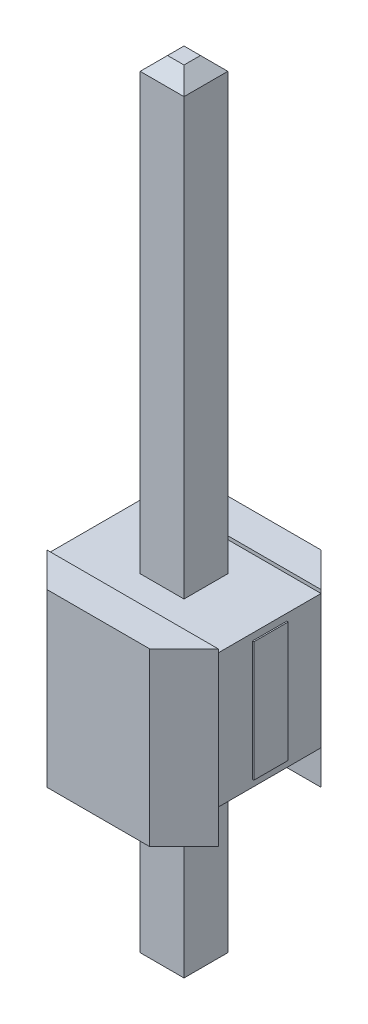
ISO-10303-21;
HEADER;
FILE_DESCRIPTION(('STEP AP214'),'2;1');
FILE_NAME('part.step','',(''),(''),'','','');
FILE_SCHEMA(('AUTOMOTIVE_DESIGN { 1 0 10303 214 1 1 1 1 }'));
ENDSEC;
DATA;
#1=APPLICATION_CONTEXT('core data for automotive mechanical design processes');
#2=APPLICATION_PROTOCOL_DEFINITION('international standard','automotive_design',2000,#1);
#3=PRODUCT_CONTEXT('',#1,'mechanical');
#4=PRODUCT('Part','Part','',(#3));
#5=PRODUCT_RELATED_PRODUCT_CATEGORY('part','',(#4));
#6=PRODUCT_DEFINITION_FORMATION('','',#4);
#7=PRODUCT_DEFINITION_CONTEXT('part definition',#1,'design');
#8=PRODUCT_DEFINITION('design','',#6,#7);
#9=PRODUCT_DEFINITION_SHAPE('','',#8);
#10=(LENGTH_UNIT() NAMED_UNIT(*) SI_UNIT(.MILLI.,.METRE.));
#11=(NAMED_UNIT(*) PLANE_ANGLE_UNIT() SI_UNIT($,.RADIAN.));
#12=(NAMED_UNIT(*) SI_UNIT($,.STERADIAN.) SOLID_ANGLE_UNIT());
#13=UNCERTAINTY_MEASURE_WITH_UNIT(LENGTH_MEASURE(1.E-05),#10,'distance_accuracy_value','');
#14=(GEOMETRIC_REPRESENTATION_CONTEXT(3) GLOBAL_UNCERTAINTY_ASSIGNED_CONTEXT((#13)) GLOBAL_UNIT_ASSIGNED_CONTEXT((#10,
#11,#12)) REPRESENTATION_CONTEXT('',''));
#15=CARTESIAN_POINT('',(0.,0.,0.));
#16=DIRECTION('',(0.,0.,1.));
#17=DIRECTION('',(1.,0.,0.));
#18=AXIS2_PLACEMENT_3D('',#15,#16,#17);
#19=CARTESIAN_POINT('',(1.25,0.,0.));
#20=DIRECTION('',(1.,0.,0.));
#21=DIRECTION('',(0.,0.,-1.));
#22=AXIS2_PLACEMENT_3D('',#19,#20,#21);
#23=PLANE('',#22);
#24=DIRECTION('',(0.,0.,1.));
#25=VECTOR('',#24,1.);
#26=CARTESIAN_POINT('',(1.25,1.2,-0.75));
#27=LINE('',#26,#25);
#28=CARTESIAN_POINT('',(1.25,1.2,-0.75));
#29=VERTEX_POINT('',#28);
#30=CARTESIAN_POINT('',(1.25,1.2,0.750000000000001));
#31=VERTEX_POINT('',#30);
#32=EDGE_CURVE('E302',#29,#31,#27,.T.);
#33=ORIENTED_EDGE('',*,*,#32,.T.);
#34=DIRECTION('',(0.,-1.,0.));
#35=VECTOR('',#34,1.);
#36=CARTESIAN_POINT('',(1.25,-1.25,0.75));
#37=LINE('',#36,#35);
#38=CARTESIAN_POINT('',(1.25,-0.75,0.750000000000001));
#39=VERTEX_POINT('',#38);
#40=EDGE_CURVE('E393',#31,#39,#37,.T.);
#41=ORIENTED_EDGE('',*,*,#40,.T.);
#42=DIRECTION('',(0.,0.,1.));
#43=VECTOR('',#42,1.);
#44=CARTESIAN_POINT('',(1.25,-0.75,-0.75));
#45=LINE('',#44,#43);
#46=CARTESIAN_POINT('',(1.25,-0.75,-0.75));
#47=VERTEX_POINT('',#46);
#48=EDGE_CURVE('E292',#47,#39,#45,.T.);
#49=ORIENTED_EDGE('',*,*,#48,.F.);
#50=DIRECTION('',(0.,1.,0.));
#51=VECTOR('',#50,1.);
#52=CARTESIAN_POINT('',(1.25,0.,-0.749999999999998));
#53=LINE('',#52,#51);
#54=EDGE_CURVE('E391',#47,#29,#53,.T.);
#55=ORIENTED_EDGE('',*,*,#54,.T.);
#56=EDGE_LOOP('',(#33,#41,#49,#55));
#57=FACE_BOUND('',#56,.T.);
#58=DIRECTION('',(0.,0.,1.));
#59=VECTOR('',#58,1.);
#60=CARTESIAN_POINT('',(1.25,-0.65,0.));
#61=LINE('',#60,#59);
#62=CARTESIAN_POINT('',(1.25,-0.65,-0.25));
#63=VERTEX_POINT('',#62);
#64=CARTESIAN_POINT('',(1.25,-0.65,0.25));
#65=VERTEX_POINT('',#64);
#66=EDGE_CURVE('E285',#63,#65,#61,.T.);
#67=ORIENTED_EDGE('',*,*,#66,.T.);
#68=DIRECTION('',(0.,1.,0.));
#69=VECTOR('',#68,1.);
#70=CARTESIAN_POINT('',(1.25,0.,0.25));
#71=LINE('',#70,#69);
#72=CARTESIAN_POINT('',(1.25,1.1,0.25));
#73=VERTEX_POINT('',#72);
#74=EDGE_CURVE('E273',#65,#73,#71,.T.);
#75=ORIENTED_EDGE('',*,*,#74,.T.);
#76=DIRECTION('',(0.,0.,-1.));
#77=VECTOR('',#76,1.);
#78=CARTESIAN_POINT('',(1.25,1.1,0.));
#79=LINE('',#78,#77);
#80=CARTESIAN_POINT('',(1.25,1.1,-0.25));
#81=VERTEX_POINT('',#80);
#82=EDGE_CURVE('E274',#73,#81,#79,.T.);
#83=ORIENTED_EDGE('',*,*,#82,.T.);
#84=DIRECTION('',(0.,-1.,0.));
#85=VECTOR('',#84,1.);
#86=CARTESIAN_POINT('',(1.25,0.,-0.25));
#87=LINE('',#86,#85);
#88=EDGE_CURVE('E278',#81,#63,#87,.T.);
#89=ORIENTED_EDGE('',*,*,#88,.T.);
#90=EDGE_LOOP('',(#67,#75,#83,#89));
#91=FACE_BOUND('',#90,.T.);
#92=ADVANCED_FACE('F39',(#57,#91),#23,.T.);
#93=CARTESIAN_POINT('',(-1.25,0.,0.));
#94=DIRECTION('',(1.,0.,0.));
#95=DIRECTION('',(0.,0.,-1.));
#96=AXIS2_PLACEMENT_3D('',#93,#94,#95);
#97=PLANE('',#96);
#98=DIRECTION('',(0.,0.,1.));
#99=VECTOR('',#98,1.);
#100=CARTESIAN_POINT('',(-1.25,-0.75,-0.75));
#101=LINE('',#100,#99);
#102=CARTESIAN_POINT('',(-1.25,-0.75,-0.75));
#103=VERTEX_POINT('',#102);
#104=CARTESIAN_POINT('',(-1.25,-0.75,0.750000000000001));
#105=VERTEX_POINT('',#104);
#106=EDGE_CURVE('E311',#103,#105,#101,.T.);
#107=ORIENTED_EDGE('',*,*,#106,.T.);
#108=DIRECTION('',(0.,1.,0.));
#109=VECTOR('',#108,1.);
#110=CARTESIAN_POINT('',(-1.25,0.,0.749999999999998));
#111=LINE('',#110,#109);
#112=CARTESIAN_POINT('',(-1.25,1.2,0.750000000000001));
#113=VERTEX_POINT('',#112);
#114=EDGE_CURVE('E423',#105,#113,#111,.T.);
#115=ORIENTED_EDGE('',*,*,#114,.T.);
#116=DIRECTION('',(0.,0.,1.));
#117=VECTOR('',#116,1.);
#118=CARTESIAN_POINT('',(-1.25,1.2,-0.75));
#119=LINE('',#118,#117);
#120=CARTESIAN_POINT('',(-1.25,1.2,-0.75));
#121=VERTEX_POINT('',#120);
#122=EDGE_CURVE('E320',#121,#113,#119,.T.);
#123=ORIENTED_EDGE('',*,*,#122,.F.);
#124=DIRECTION('',(0.,-1.,0.));
#125=VECTOR('',#124,1.);
#126=CARTESIAN_POINT('',(-1.25,-1.25,-0.749999999999999));
#127=LINE('',#126,#125);
#128=EDGE_CURVE('E421',#121,#103,#127,.T.);
#129=ORIENTED_EDGE('',*,*,#128,.T.);
#130=EDGE_LOOP('',(#107,#115,#123,#129));
#131=FACE_BOUND('',#130,.T.);
#132=DIRECTION('',(0.,1.,0.));
#133=VECTOR('',#132,1.);
#134=CARTESIAN_POINT('',(-1.25,0.,0.25));
#135=LINE('',#134,#133);
#136=CARTESIAN_POINT('',(-1.25,-0.65,0.25));
#137=VERTEX_POINT('',#136);
#138=CARTESIAN_POINT('',(-1.25,1.1,0.25));
#139=VERTEX_POINT('',#138);
#140=EDGE_CURVE('E434',#137,#139,#135,.T.);
#141=ORIENTED_EDGE('',*,*,#140,.F.);
#142=DIRECTION('',(0.,0.,1.));
#143=VECTOR('',#142,1.);
#144=CARTESIAN_POINT('',(-1.25,-0.65,0.));
#145=LINE('',#144,#143);
#146=CARTESIAN_POINT('',(-1.25,-0.65,-0.25));
#147=VERTEX_POINT('',#146);
#148=EDGE_CURVE('E431',#147,#137,#145,.T.);
#149=ORIENTED_EDGE('',*,*,#148,.F.);
#150=DIRECTION('',(0.,-1.,0.));
#151=VECTOR('',#150,1.);
#152=CARTESIAN_POINT('',(-1.25,0.,-0.25));
#153=LINE('',#152,#151);
#154=CARTESIAN_POINT('',(-1.25,1.1,-0.25));
#155=VERTEX_POINT('',#154);
#156=EDGE_CURVE('E428',#155,#147,#153,.T.);
#157=ORIENTED_EDGE('',*,*,#156,.F.);
#158=DIRECTION('',(0.,0.,-1.));
#159=VECTOR('',#158,1.);
#160=CARTESIAN_POINT('',(-1.25,1.1,0.));
#161=LINE('',#160,#159);
#162=EDGE_CURVE('E425',#139,#155,#161,.T.);
#163=ORIENTED_EDGE('',*,*,#162,.F.);
#164=EDGE_LOOP('',(#141,#149,#157,#163));
#165=FACE_BOUND('',#164,.T.);
#166=ADVANCED_FACE('F530',(#131,#165),#97,.F.);
#167=CARTESIAN_POINT('',(0.32,7.75,0.320000000000001));
#168=DIRECTION('',(0.,0.,-1.));
#169=DIRECTION('',(0.,1.,0.));
#170=AXIS2_PLACEMENT_3D('',#167,#168,#169);
#171=PLANE('',#170);
#172=DIRECTION('',(0.,-1.,0.));
#173=VECTOR('',#172,1.);
#174=CARTESIAN_POINT('',(0.32,7.75,0.320000000000001));
#175=LINE('',#174,#173);
#176=CARTESIAN_POINT('',(0.32,7.55,0.320000000000001));
#177=VERTEX_POINT('',#176);
#178=CARTESIAN_POINT('',(0.32,1.2,0.32));
#179=VERTEX_POINT('',#178);
#180=EDGE_CURVE('E374',#177,#179,#175,.T.);
#181=ORIENTED_EDGE('',*,*,#180,.F.);
#182=DIRECTION('',(-1.,0.,0.));
#183=VECTOR('',#182,1.);
#184=CARTESIAN_POINT('',(0.32,7.55,0.320000000000001));
#185=LINE('',#184,#183);
#186=CARTESIAN_POINT('',(-0.32,7.55,0.320000000000001));
#187=VERTEX_POINT('',#186);
#188=EDGE_CURVE('E451',#177,#187,#185,.T.);
#189=ORIENTED_EDGE('',*,*,#188,.T.);
#190=DIRECTION('',(0.,-1.,0.));
#191=VECTOR('',#190,1.);
#192=CARTESIAN_POINT('',(-0.32,7.75,0.320000000000001));
#193=LINE('',#192,#191);
#194=CARTESIAN_POINT('',(-0.32,1.2,0.32));
#195=VERTEX_POINT('',#194);
#196=EDGE_CURVE('E381',#187,#195,#193,.T.);
#197=ORIENTED_EDGE('',*,*,#196,.T.);
#198=DIRECTION('',(-1.,0.,0.));
#199=VECTOR('',#198,1.);
#200=CARTESIAN_POINT('',(0.32,1.2,0.32));
#201=LINE('',#200,#199);
#202=EDGE_CURVE('E367',#179,#195,#201,.T.);
#203=ORIENTED_EDGE('',*,*,#202,.F.);
#204=EDGE_LOOP('',(#181,#189,#197,#203));
#205=FACE_BOUND('',#204,.T.);
#206=ADVANCED_FACE('F537',(#205),#171,.F.);
#207=CARTESIAN_POINT('',(0.32,7.75,-0.32));
#208=DIRECTION('',(0.,0.,1.));
#209=DIRECTION('',(0.,-1.,0.));
#210=AXIS2_PLACEMENT_3D('',#207,#208,#209);
#211=PLANE('',#210);
#212=DIRECTION('',(0.,1.,0.));
#213=VECTOR('',#212,1.);
#214=CARTESIAN_POINT('',(-0.32,7.75,-0.32));
#215=LINE('',#214,#213);
#216=CARTESIAN_POINT('',(-0.32,1.2,-0.320000000000001));
#217=VERTEX_POINT('',#216);
#218=CARTESIAN_POINT('',(-0.32,7.55,-0.32));
#219=VERTEX_POINT('',#218);
#220=EDGE_CURVE('E383',#217,#219,#215,.T.);
#221=ORIENTED_EDGE('',*,*,#220,.T.);
#222=DIRECTION('',(1.,0.,0.));
#223=VECTOR('',#222,1.);
#224=CARTESIAN_POINT('',(0.32,7.55,-0.32));
#225=LINE('',#224,#223);
#226=CARTESIAN_POINT('',(0.32,7.55,-0.32));
#227=VERTEX_POINT('',#226);
#228=EDGE_CURVE('E446',#219,#227,#225,.T.);
#229=ORIENTED_EDGE('',*,*,#228,.T.);
#230=DIRECTION('',(0.,1.,0.));
#231=VECTOR('',#230,1.);
#232=CARTESIAN_POINT('',(0.32,7.75,-0.32));
#233=LINE('',#232,#231);
#234=CARTESIAN_POINT('',(0.32,1.2,-0.32));
#235=VERTEX_POINT('',#234);
#236=EDGE_CURVE('E376',#235,#227,#233,.T.);
#237=ORIENTED_EDGE('',*,*,#236,.F.);
#238=DIRECTION('',(1.,0.,0.));
#239=VECTOR('',#238,1.);
#240=CARTESIAN_POINT('',(0.32,1.2,-0.32));
#241=LINE('',#240,#239);
#242=EDGE_CURVE('E365',#217,#235,#241,.T.);
#243=ORIENTED_EDGE('',*,*,#242,.F.);
#244=EDGE_LOOP('',(#221,#229,#237,#243));
#245=FACE_BOUND('',#244,.T.);
#246=ADVANCED_FACE('F592',(#245),#211,.F.);
#247=CARTESIAN_POINT('',(0.32,0.,0.));
#248=DIRECTION('',(-1.,0.,0.));
#249=DIRECTION('',(0.,0.,1.));
#250=AXIS2_PLACEMENT_3D('',#247,#248,#249);
#251=PLANE('',#250);
#252=ORIENTED_EDGE('',*,*,#236,.T.);
#253=DIRECTION('',(0.,0.,1.));
#254=VECTOR('',#253,1.);
#255=CARTESIAN_POINT('',(0.32,7.55,0.));
#256=LINE('',#255,#254);
#257=EDGE_CURVE('E449',#227,#177,#256,.T.);
#258=ORIENTED_EDGE('',*,*,#257,.T.);
#259=ORIENTED_EDGE('',*,*,#180,.T.);
#260=DIRECTION('',(0.,0.,1.));
#261=VECTOR('',#260,1.);
#262=CARTESIAN_POINT('',(0.32,1.2,0.));
#263=LINE('',#262,#261);
#264=EDGE_CURVE('E370',#235,#179,#263,.T.);
#265=ORIENTED_EDGE('',*,*,#264,.F.);
#266=EDGE_LOOP('',(#252,#258,#259,#265));
#267=FACE_BOUND('',#266,.T.);
#268=ADVANCED_FACE('F522',(#267),#251,.F.);
#269=CARTESIAN_POINT('',(-0.32,0.,0.));
#270=DIRECTION('',(-1.,0.,0.));
#271=DIRECTION('',(0.,0.,1.));
#272=AXIS2_PLACEMENT_3D('',#269,#270,#271);
#273=PLANE('',#272);
#274=ORIENTED_EDGE('',*,*,#196,.F.);
#275=DIRECTION('',(0.,0.,-1.));
#276=VECTOR('',#275,1.);
#277=CARTESIAN_POINT('',(-0.32,7.55,-0.32));
#278=LINE('',#277,#276);
#279=EDGE_CURVE('E453',#187,#219,#278,.T.);
#280=ORIENTED_EDGE('',*,*,#279,.T.);
#281=ORIENTED_EDGE('',*,*,#220,.F.);
#282=DIRECTION('',(0.,0.,1.));
#283=VECTOR('',#282,1.);
#284=CARTESIAN_POINT('',(-0.32,1.2,0.));
#285=LINE('',#284,#283);
#286=EDGE_CURVE('E388',#217,#195,#285,.T.);
#287=ORIENTED_EDGE('',*,*,#286,.T.);
#288=EDGE_LOOP('',(#274,#280,#281,#287));
#289=FACE_BOUND('',#288,.T.);
#290=ADVANCED_FACE('F590',(#289),#273,.T.);
#291=CARTESIAN_POINT('',(0.32,7.75,0.320000000000001));
#292=DIRECTION('',(0.,-1.,0.));
#293=DIRECTION('',(0.,0.,-1.));
#294=AXIS2_PLACEMENT_3D('',#291,#292,#293);
#295=PLANE('',#294);
#296=DIRECTION('',(0.,0.,-1.));
#297=VECTOR('',#296,1.);
#298=CARTESIAN_POINT('',(0.119999999999999,7.75,0.320000000000001));
#299=LINE('',#298,#297);
#300=CARTESIAN_POINT('',(0.119999999999999,7.75,0.12));
#301=VERTEX_POINT('',#300);
#302=CARTESIAN_POINT('',(0.119999999999999,7.75,-0.119999999999999));
#303=VERTEX_POINT('',#302);
#304=EDGE_CURVE('E441',#301,#303,#299,.T.);
#305=ORIENTED_EDGE('',*,*,#304,.T.);
#306=DIRECTION('',(-1.,0.,0.));
#307=VECTOR('',#306,1.);
#308=CARTESIAN_POINT('',(0.32,7.75,-0.119999999999999));
#309=LINE('',#308,#307);
#310=CARTESIAN_POINT('',(-0.119999999999999,7.75,-0.119999999999999));
#311=VERTEX_POINT('',#310);
#312=EDGE_CURVE('E443',#303,#311,#309,.T.);
#313=ORIENTED_EDGE('',*,*,#312,.T.);
#314=DIRECTION('',(0.,0.,1.));
#315=VECTOR('',#314,1.);
#316=CARTESIAN_POINT('',(-0.119999999999999,7.75,0.320000000000001));
#317=LINE('',#316,#315);
#318=CARTESIAN_POINT('',(-0.119999999999999,7.75,0.12));
#319=VERTEX_POINT('',#318);
#320=EDGE_CURVE('E437',#311,#319,#317,.T.);
#321=ORIENTED_EDGE('',*,*,#320,.T.);
#322=DIRECTION('',(1.,0.,0.));
#323=VECTOR('',#322,1.);
#324=CARTESIAN_POINT('',(0.32,7.75,0.12));
#325=LINE('',#324,#323);
#326=EDGE_CURVE('E439',#319,#301,#325,.T.);
#327=ORIENTED_EDGE('',*,*,#326,.T.);
#328=EDGE_LOOP('',(#305,#313,#321,#327));
#329=FACE_BOUND('',#328,.T.);
#330=ADVANCED_FACE('F566',(#329),#295,.F.);
#331=CARTESIAN_POINT('',(1.25,1.2,-0.75));
#332=DIRECTION('',(0.,-1.,0.));
#333=DIRECTION('',(0.,0.,-1.));
#334=AXIS2_PLACEMENT_3D('',#331,#332,#333);
#335=PLANE('',#334);
#336=ORIENTED_EDGE('',*,*,#122,.T.);
#337=DIRECTION('',(-1.,0.,0.));
#338=VECTOR('',#337,1.);
#339=CARTESIAN_POINT('',(1.25,1.2,0.750000000000001));
#340=LINE('',#339,#338);
#341=EDGE_CURVE('E340',#31,#113,#340,.T.);
#342=ORIENTED_EDGE('',*,*,#341,.F.);
#343=ORIENTED_EDGE('',*,*,#32,.F.);
#344=DIRECTION('',(-1.,0.,0.));
#345=VECTOR('',#344,1.);
#346=CARTESIAN_POINT('',(1.25,1.2,-0.75));
#347=LINE('',#346,#345);
#348=EDGE_CURVE('E337',#29,#121,#347,.T.);
#349=ORIENTED_EDGE('',*,*,#348,.T.);
#350=EDGE_LOOP('',(#336,#342,#343,#349));
#351=FACE_BOUND('',#350,.T.);
#352=ORIENTED_EDGE('',*,*,#242,.T.);
#353=ORIENTED_EDGE('',*,*,#264,.T.);
#354=ORIENTED_EDGE('',*,*,#202,.T.);
#355=ORIENTED_EDGE('',*,*,#286,.F.);
#356=EDGE_LOOP('',(#352,#353,#354,#355));
#357=FACE_BOUND('',#356,.T.);
#358=ADVANCED_FACE('F562',(#351,#357),#335,.F.);
#359=CARTESIAN_POINT('',(1.25,-0.75,-0.75));
#360=DIRECTION('',(0.,-1.,0.));
#361=DIRECTION('',(0.,0.,-1.));
#362=AXIS2_PLACEMENT_3D('',#359,#360,#361);
#363=PLANE('',#362);
#364=ORIENTED_EDGE('',*,*,#106,.F.);
#365=DIRECTION('',(-1.,0.,0.));
#366=VECTOR('',#365,1.);
#367=CARTESIAN_POINT('',(1.25,-0.75,-0.75));
#368=LINE('',#367,#366);
#369=EDGE_CURVE('E308',#47,#103,#368,.T.);
#370=ORIENTED_EDGE('',*,*,#369,.F.);
#371=ORIENTED_EDGE('',*,*,#48,.T.);
#372=DIRECTION('',(-1.,0.,0.));
#373=VECTOR('',#372,1.);
#374=CARTESIAN_POINT('',(1.25,-0.75,0.750000000000001));
#375=LINE('',#374,#373);
#376=EDGE_CURVE('E354',#39,#105,#375,.T.);
#377=ORIENTED_EDGE('',*,*,#376,.T.);
#378=EDGE_LOOP('',(#364,#370,#371,#377));
#379=FACE_BOUND('',#378,.T.);
#380=DIRECTION('',(0.,0.,1.));
#381=VECTOR('',#380,1.);
#382=CARTESIAN_POINT('',(0.32,-0.75,0.));
#383=LINE('',#382,#381);
#384=CARTESIAN_POINT('',(0.32,-0.750000000000001,-0.320000000000001));
#385=VERTEX_POINT('',#384);
#386=CARTESIAN_POINT('',(0.32,-0.750000000000001,0.32));
#387=VERTEX_POINT('',#386);
#388=EDGE_CURVE('E363',#385,#387,#383,.T.);
#389=ORIENTED_EDGE('',*,*,#388,.F.);
#390=DIRECTION('',(1.,0.,0.));
#391=VECTOR('',#390,1.);
#392=CARTESIAN_POINT('',(0.32,-0.750000000000001,-0.320000000000001));
#393=LINE('',#392,#391);
#394=CARTESIAN_POINT('',(-0.32,-0.750000000000001,-0.320000000000001));
#395=VERTEX_POINT('',#394);
#396=EDGE_CURVE('E327',#395,#385,#393,.T.);
#397=ORIENTED_EDGE('',*,*,#396,.F.);
#398=DIRECTION('',(0.,0.,1.));
#399=VECTOR('',#398,1.);
#400=CARTESIAN_POINT('',(-0.32,-0.75,0.));
#401=LINE('',#400,#399);
#402=CARTESIAN_POINT('',(-0.32,-0.75,0.320000000000001));
#403=VERTEX_POINT('',#402);
#404=EDGE_CURVE('E380',#395,#403,#401,.T.);
#405=ORIENTED_EDGE('',*,*,#404,.T.);
#406=DIRECTION('',(-1.,0.,0.));
#407=VECTOR('',#406,1.);
#408=CARTESIAN_POINT('',(0.32,-0.750000000000001,0.32));
#409=LINE('',#408,#407);
#410=EDGE_CURVE('E360',#387,#403,#409,.T.);
#411=ORIENTED_EDGE('',*,*,#410,.F.);
#412=EDGE_LOOP('',(#389,#397,#405,#411));
#413=FACE_BOUND('',#412,.T.);
#414=ADVANCED_FACE('F565',(#379,#413),#363,.T.);
#415=CARTESIAN_POINT('',(1.25,-1.25,-0.75));
#416=DIRECTION('',(0.,0.,1.));
#417=DIRECTION('',(0.,-1.,0.));
#418=AXIS2_PLACEMENT_3D('',#415,#416,#417);
#419=PLANE('',#418);
#420=DIRECTION('',(0.,1.,0.));
#421=VECTOR('',#420,1.);
#422=CARTESIAN_POINT('',(-1.25,-1.25,-0.75));
#423=LINE('',#422,#421);
#424=CARTESIAN_POINT('',(-1.25,-1.25,-0.75));
#425=VERTEX_POINT('',#424);
#426=EDGE_CURVE('E288',#425,#103,#423,.T.);
#427=ORIENTED_EDGE('',*,*,#426,.F.);
#428=DIRECTION('',(-1.,0.,0.));
#429=VECTOR('',#428,1.);
#430=CARTESIAN_POINT('',(1.25,-1.25,-0.75));
#431=LINE('',#430,#429);
#432=CARTESIAN_POINT('',(1.25,-1.25,-0.75));
#433=VERTEX_POINT('',#432);
#434=EDGE_CURVE('E325',#433,#425,#431,.T.);
#435=ORIENTED_EDGE('',*,*,#434,.F.);
#436=DIRECTION('',(0.,1.,0.));
#437=VECTOR('',#436,1.);
#438=CARTESIAN_POINT('',(1.25,-1.25,-0.75));
#439=LINE('',#438,#437);
#440=EDGE_CURVE('E289',#433,#47,#439,.T.);
#441=ORIENTED_EDGE('',*,*,#440,.T.);
#442=ORIENTED_EDGE('',*,*,#369,.T.);
#443=EDGE_LOOP('',(#427,#435,#441,#442));
#444=FACE_BOUND('',#443,.T.);
#445=ADVANCED_FACE('F548',(#444),#419,.T.);
#446=CARTESIAN_POINT('',(1.25,-1.25,-0.75));
#447=DIRECTION('',(0.,1.,0.));
#448=DIRECTION('',(0.,0.,1.));
#449=AXIS2_PLACEMENT_3D('',#446,#447,#448);
#450=PLANE('',#449);
#451=DIRECTION('',(-1.,0.,0.));
#452=VECTOR('',#451,1.);
#453=CARTESIAN_POINT('',(1.25,-1.25,-1.25));
#454=LINE('',#453,#452);
#455=CARTESIAN_POINT('',(0.75,-1.25,-1.25));
#456=VERTEX_POINT('',#455);
#457=CARTESIAN_POINT('',(-0.749999999999998,-1.25,-1.25));
#458=VERTEX_POINT('',#457);
#459=EDGE_CURVE('E328',#456,#458,#454,.T.);
#460=ORIENTED_EDGE('',*,*,#459,.F.);
#461=DIRECTION('',(-0.707106781186546,0.,-0.707106781186549));
#462=VECTOR('',#461,1.);
#463=CARTESIAN_POINT('',(0.749999999999999,-1.25,-1.25));
#464=LINE('',#463,#462);
#465=EDGE_CURVE('E415',#456,#433,#464,.F.);
#466=ORIENTED_EDGE('',*,*,#465,.T.);
#467=ORIENTED_EDGE('',*,*,#434,.T.);
#468=DIRECTION('',(0.707106781186549,0.,-0.707106781186546));
#469=VECTOR('',#468,1.);
#470=CARTESIAN_POINT('',(-1.25,-1.25,-0.749999999999999));
#471=LINE('',#470,#469);
#472=EDGE_CURVE('E413',#425,#458,#471,.T.);
#473=ORIENTED_EDGE('',*,*,#472,.T.);
#474=EDGE_LOOP('',(#460,#466,#467,#473));
#475=FACE_BOUND('',#474,.T.);
#476=ADVANCED_FACE('F544',(#475),#450,.F.);
#477=CARTESIAN_POINT('',(1.25,1.25,-1.25));
#478=DIRECTION('',(0.,0.,-1.));
#479=DIRECTION('',(0.,1.,0.));
#480=AXIS2_PLACEMENT_3D('',#477,#478,#479);
#481=PLANE('',#480);
#482=DIRECTION('',(-1.,0.,0.));
#483=VECTOR('',#482,1.);
#484=CARTESIAN_POINT('',(1.25,1.25,-1.25));
#485=LINE('',#484,#483);
#486=CARTESIAN_POINT('',(0.75,1.25,-1.25));
#487=VERTEX_POINT('',#486);
#488=CARTESIAN_POINT('',(-0.749999999999998,1.25,-1.25));
#489=VERTEX_POINT('',#488);
#490=EDGE_CURVE('E331',#487,#489,#485,.T.);
#491=ORIENTED_EDGE('',*,*,#490,.F.);
#492=DIRECTION('',(0.,-1.,0.));
#493=VECTOR('',#492,1.);
#494=CARTESIAN_POINT('',(0.75,1.25,-1.25));
#495=LINE('',#494,#493);
#496=EDGE_CURVE('E410',#487,#456,#495,.T.);
#497=ORIENTED_EDGE('',*,*,#496,.T.);
#498=ORIENTED_EDGE('',*,*,#459,.T.);
#499=DIRECTION('',(0.,1.,0.));
#500=VECTOR('',#499,1.);
#501=CARTESIAN_POINT('',(-0.749999999999998,1.25,-1.25));
#502=LINE('',#501,#500);
#503=EDGE_CURVE('E408',#458,#489,#502,.T.);
#504=ORIENTED_EDGE('',*,*,#503,.T.);
#505=EDGE_LOOP('',(#491,#497,#498,#504));
#506=FACE_BOUND('',#505,.T.);
#507=ADVANCED_FACE('F547',(#506),#481,.T.);
#508=CARTESIAN_POINT('',(1.25,1.25,-1.25));
#509=DIRECTION('',(0.,-1.,0.));
#510=DIRECTION('',(0.,0.,-1.));
#511=AXIS2_PLACEMENT_3D('',#508,#509,#510);
#512=PLANE('',#511);
#513=DIRECTION('',(-1.,0.,0.));
#514=VECTOR('',#513,1.);
#515=CARTESIAN_POINT('',(1.25,1.25,-0.75));
#516=LINE('',#515,#514);
#517=CARTESIAN_POINT('',(1.25,1.25,-0.75));
#518=VERTEX_POINT('',#517);
#519=CARTESIAN_POINT('',(-1.25,1.25,-0.75));
#520=VERTEX_POINT('',#519);
#521=EDGE_CURVE('E334',#518,#520,#516,.T.);
#522=ORIENTED_EDGE('',*,*,#521,.F.);
#523=DIRECTION('',(0.707106781186546,0.,0.707106781186549));
#524=VECTOR('',#523,1.);
#525=CARTESIAN_POINT('',(0.75,1.25,-1.25));
#526=LINE('',#525,#524);
#527=EDGE_CURVE('E419',#518,#487,#526,.F.);
#528=ORIENTED_EDGE('',*,*,#527,.T.);
#529=ORIENTED_EDGE('',*,*,#490,.T.);
#530=DIRECTION('',(-0.707106781186549,0.,0.707106781186546));
#531=VECTOR('',#530,1.);
#532=CARTESIAN_POINT('',(-1.25,1.25,-0.749999999999999));
#533=LINE('',#532,#531);
#534=EDGE_CURVE('E417',#489,#520,#533,.T.);
#535=ORIENTED_EDGE('',*,*,#534,.T.);
#536=EDGE_LOOP('',(#522,#528,#529,#535));
#537=FACE_BOUND('',#536,.T.);
#538=ADVANCED_FACE('F552',(#537),#512,.F.);
#539=CARTESIAN_POINT('',(1.25,1.25,-0.75));
#540=DIRECTION('',(0.,0.,-1.));
#541=DIRECTION('',(-1.,0.,0.));
#542=AXIS2_PLACEMENT_3D('',#539,#540,#541);
#543=PLANE('',#542);
#544=DIRECTION('',(0.,-1.,0.));
#545=VECTOR('',#544,1.);
#546=CARTESIAN_POINT('',(-1.25,1.25,-0.75));
#547=LINE('',#546,#545);
#548=EDGE_CURVE('E293',#520,#121,#547,.T.);
#549=ORIENTED_EDGE('',*,*,#548,.T.);
#550=ORIENTED_EDGE('',*,*,#348,.F.);
#551=DIRECTION('',(0.,-1.,0.));
#552=VECTOR('',#551,1.);
#553=CARTESIAN_POINT('',(1.25,1.25,-0.75));
#554=LINE('',#553,#552);
#555=EDGE_CURVE('E305',#518,#29,#554,.T.);
#556=ORIENTED_EDGE('',*,*,#555,.F.);
#557=ORIENTED_EDGE('',*,*,#521,.T.);
#558=EDGE_LOOP('',(#549,#550,#556,#557));
#559=FACE_BOUND('',#558,.T.);
#560=ADVANCED_FACE('F556',(#559),#543,.F.);
#561=CARTESIAN_POINT('',(1.25,1.25,0.750000000000001));
#562=DIRECTION('',(0.,0.,-1.));
#563=DIRECTION('',(-1.,0.,0.));
#564=AXIS2_PLACEMENT_3D('',#561,#562,#563);
#565=PLANE('',#564);
#566=DIRECTION('',(0.,-1.,0.));
#567=VECTOR('',#566,1.);
#568=CARTESIAN_POINT('',(-1.25,1.25,0.750000000000001));
#569=LINE('',#568,#567);
#570=CARTESIAN_POINT('',(-1.25,1.25,0.750000000000001));
#571=VERTEX_POINT('',#570);
#572=EDGE_CURVE('E317',#571,#113,#569,.T.);
#573=ORIENTED_EDGE('',*,*,#572,.F.);
#574=DIRECTION('',(-1.,0.,0.));
#575=VECTOR('',#574,1.);
#576=CARTESIAN_POINT('',(1.25,1.25,0.750000000000001));
#577=LINE('',#576,#575);
#578=CARTESIAN_POINT('',(1.25,1.25,0.750000000000001));
#579=VERTEX_POINT('',#578);
#580=EDGE_CURVE('E343',#579,#571,#577,.T.);
#581=ORIENTED_EDGE('',*,*,#580,.F.);
#582=DIRECTION('',(0.,-1.,0.));
#583=VECTOR('',#582,1.);
#584=CARTESIAN_POINT('',(1.25,1.25,0.750000000000001));
#585=LINE('',#584,#583);
#586=EDGE_CURVE('E299',#579,#31,#585,.T.);
#587=ORIENTED_EDGE('',*,*,#586,.T.);
#588=ORIENTED_EDGE('',*,*,#341,.T.);
#589=EDGE_LOOP('',(#573,#581,#587,#588));
#590=FACE_BOUND('',#589,.T.);
#591=ADVANCED_FACE('F560',(#590),#565,.T.);
#592=CARTESIAN_POINT('',(1.25,1.25,0.750000000000001));
#593=DIRECTION('',(0.,-1.,0.));
#594=DIRECTION('',(0.,0.,-1.));
#595=AXIS2_PLACEMENT_3D('',#592,#593,#594);
#596=PLANE('',#595);
#597=DIRECTION('',(-1.,0.,0.));
#598=VECTOR('',#597,1.);
#599=CARTESIAN_POINT('',(1.25,1.25,1.25));
#600=LINE('',#599,#598);
#601=CARTESIAN_POINT('',(0.749999999999998,1.25,1.25));
#602=VERTEX_POINT('',#601);
#603=CARTESIAN_POINT('',(-0.75,1.25,1.25));
#604=VERTEX_POINT('',#603);
#605=EDGE_CURVE('E345',#602,#604,#600,.T.);
#606=ORIENTED_EDGE('',*,*,#605,.F.);
#607=DIRECTION('',(0.707106781186549,0.,-0.707106781186546));
#608=VECTOR('',#607,1.);
#609=CARTESIAN_POINT('',(1.25,1.25,0.75));
#610=LINE('',#609,#608);
#611=EDGE_CURVE('E406',#602,#579,#610,.T.);
#612=ORIENTED_EDGE('',*,*,#611,.T.);
#613=ORIENTED_EDGE('',*,*,#580,.T.);
#614=DIRECTION('',(-0.707106781186546,0.,-0.707106781186549));
#615=VECTOR('',#614,1.);
#616=CARTESIAN_POINT('',(-0.75,1.25,1.25));
#617=LINE('',#616,#615);
#618=EDGE_CURVE('E404',#571,#604,#617,.F.);
#619=ORIENTED_EDGE('',*,*,#618,.T.);
#620=EDGE_LOOP('',(#606,#612,#613,#619));
#621=FACE_BOUND('',#620,.T.);
#622=ADVANCED_FACE('F570',(#621),#596,.F.);
#623=CARTESIAN_POINT('',(1.25,1.25,1.25));
#624=DIRECTION('',(0.,0.,-1.));
#625=DIRECTION('',(0.,1.,0.));
#626=AXIS2_PLACEMENT_3D('',#623,#624,#625);
#627=PLANE('',#626);
#628=DIRECTION('',(-1.,0.,0.));
#629=VECTOR('',#628,1.);
#630=CARTESIAN_POINT('',(1.25,-1.25,1.25));
#631=LINE('',#630,#629);
#632=CARTESIAN_POINT('',(0.749999999999998,-1.25,1.25));
#633=VERTEX_POINT('',#632);
#634=CARTESIAN_POINT('',(-0.75,-1.25,1.25));
#635=VERTEX_POINT('',#634);
#636=EDGE_CURVE('E348',#633,#635,#631,.T.);
#637=ORIENTED_EDGE('',*,*,#636,.F.);
#638=DIRECTION('',(0.,1.,0.));
#639=VECTOR('',#638,1.);
#640=CARTESIAN_POINT('',(0.749999999999998,1.25,1.25));
#641=LINE('',#640,#639);
#642=EDGE_CURVE('E402',#633,#602,#641,.T.);
#643=ORIENTED_EDGE('',*,*,#642,.T.);
#644=ORIENTED_EDGE('',*,*,#605,.T.);
#645=DIRECTION('',(0.,-1.,0.));
#646=VECTOR('',#645,1.);
#647=CARTESIAN_POINT('',(-0.75,1.25,1.25));
#648=LINE('',#647,#646);
#649=EDGE_CURVE('E399',#604,#635,#648,.T.);
#650=ORIENTED_EDGE('',*,*,#649,.T.);
#651=EDGE_LOOP('',(#637,#643,#644,#650));
#652=FACE_BOUND('',#651,.T.);
#653=ADVANCED_FACE('F574',(#652),#627,.F.);
#654=CARTESIAN_POINT('',(1.25,-1.25,0.750000000000001));
#655=DIRECTION('',(0.,-1.,0.));
#656=DIRECTION('',(0.,0.,-1.));
#657=AXIS2_PLACEMENT_3D('',#654,#655,#656);
#658=PLANE('',#657);
#659=DIRECTION('',(-1.,0.,0.));
#660=VECTOR('',#659,1.);
#661=CARTESIAN_POINT('',(1.25,-1.25,0.750000000000001));
#662=LINE('',#661,#660);
#663=CARTESIAN_POINT('',(1.25,-1.25,0.750000000000001));
#664=VERTEX_POINT('',#663);
#665=CARTESIAN_POINT('',(-1.25,-1.25,0.750000000000001));
#666=VERTEX_POINT('',#665);
#667=EDGE_CURVE('E351',#664,#666,#662,.T.);
#668=ORIENTED_EDGE('',*,*,#667,.F.);
#669=DIRECTION('',(-0.707106781186549,0.,0.707106781186546));
#670=VECTOR('',#669,1.);
#671=CARTESIAN_POINT('',(1.25,-1.25,0.750000000000001));
#672=LINE('',#671,#670);
#673=EDGE_CURVE('E397',#664,#633,#672,.T.);
#674=ORIENTED_EDGE('',*,*,#673,.T.);
#675=ORIENTED_EDGE('',*,*,#636,.T.);
#676=DIRECTION('',(0.707106781186546,0.,0.707106781186549));
#677=VECTOR('',#676,1.);
#678=CARTESIAN_POINT('',(0.,-1.25,2.));
#679=LINE('',#678,#677);
#680=EDGE_CURVE('E395',#635,#666,#679,.F.);
#681=ORIENTED_EDGE('',*,*,#680,.T.);
#682=EDGE_LOOP('',(#668,#674,#675,#681));
#683=FACE_BOUND('',#682,.T.);
#684=ADVANCED_FACE('F524',(#683),#658,.T.);
#685=CARTESIAN_POINT('',(1.25,-1.25,0.750000000000001));
#686=DIRECTION('',(0.,0.,1.));
#687=DIRECTION('',(0.,-1.,0.));
#688=AXIS2_PLACEMENT_3D('',#685,#686,#687);
#689=PLANE('',#688);
#690=DIRECTION('',(0.,1.,0.));
#691=VECTOR('',#690,1.);
#692=CARTESIAN_POINT('',(-1.25,-1.25,0.750000000000001));
#693=LINE('',#692,#691);
#694=EDGE_CURVE('E314',#666,#105,#693,.T.);
#695=ORIENTED_EDGE('',*,*,#694,.T.);
#696=ORIENTED_EDGE('',*,*,#376,.F.);
#697=DIRECTION('',(0.,1.,0.));
#698=VECTOR('',#697,1.);
#699=CARTESIAN_POINT('',(1.25,-1.25,0.750000000000001));
#700=LINE('',#699,#698);
#701=EDGE_CURVE('E296',#664,#39,#700,.T.);
#702=ORIENTED_EDGE('',*,*,#701,.F.);
#703=ORIENTED_EDGE('',*,*,#667,.T.);
#704=EDGE_LOOP('',(#695,#696,#702,#703));
#705=FACE_BOUND('',#704,.T.);
#706=ADVANCED_FACE('F515',(#705),#689,.F.);
#707=CARTESIAN_POINT('',(0.32,-3.79,0.319999999999999));
#708=DIRECTION('',(0.,1.,0.));
#709=DIRECTION('',(0.,0.,1.));
#710=AXIS2_PLACEMENT_3D('',#707,#708,#709);
#711=PLANE('',#710);
#712=DIRECTION('',(0.,0.,1.));
#713=VECTOR('',#712,1.);
#714=CARTESIAN_POINT('',(0.119999999999998,-3.79,0.319999999999999));
#715=LINE('',#714,#713);
#716=CARTESIAN_POINT('',(0.119999999999998,-3.79,-0.119999999999999));
#717=VERTEX_POINT('',#716);
#718=CARTESIAN_POINT('',(0.119999999999998,-3.79,0.119999999999997));
#719=VERTEX_POINT('',#718);
#720=EDGE_CURVE('E459',#717,#719,#715,.T.);
#721=ORIENTED_EDGE('',*,*,#720,.T.);
#722=DIRECTION('',(-1.,0.,0.));
#723=VECTOR('',#722,1.);
#724=CARTESIAN_POINT('',(0.32,-3.79,0.119999999999997));
#725=LINE('',#724,#723);
#726=CARTESIAN_POINT('',(-0.119999999999998,-3.79,0.119999999999997));
#727=VERTEX_POINT('',#726);
#728=EDGE_CURVE('E461',#719,#727,#725,.T.);
#729=ORIENTED_EDGE('',*,*,#728,.T.);
#730=DIRECTION('',(0.,0.,-1.));
#731=VECTOR('',#730,1.);
#732=CARTESIAN_POINT('',(-0.119999999999998,-3.79,-0.320000000000001));
#733=LINE('',#732,#731);
#734=CARTESIAN_POINT('',(-0.119999999999998,-3.79,-0.119999999999999));
#735=VERTEX_POINT('',#734);
#736=EDGE_CURVE('E455',#727,#735,#733,.T.);
#737=ORIENTED_EDGE('',*,*,#736,.T.);
#738=DIRECTION('',(1.,0.,0.));
#739=VECTOR('',#738,1.);
#740=CARTESIAN_POINT('',(0.32,-3.79,-0.119999999999999));
#741=LINE('',#740,#739);
#742=EDGE_CURVE('E457',#735,#717,#741,.T.);
#743=ORIENTED_EDGE('',*,*,#742,.T.);
#744=EDGE_LOOP('',(#721,#729,#737,#743));
#745=FACE_BOUND('',#744,.T.);
#746=ADVANCED_FACE('F512',(#745),#711,.F.);
#747=CARTESIAN_POINT('',(0.32,-3.59,0.319999999999999));
#748=VERTEX_POINT('',#747);
#749=EDGE_CURVE('E377',#387,#748,#175,.T.);
#750=ORIENTED_EDGE('',*,*,#749,.T.);
#751=DIRECTION('',(0.,0.,-1.));
#752=VECTOR('',#751,1.);
#753=CARTESIAN_POINT('',(0.32,-3.59,0.));
#754=LINE('',#753,#752);
#755=CARTESIAN_POINT('',(0.32,-3.59,-0.320000000000001));
#756=VERTEX_POINT('',#755);
#757=EDGE_CURVE('E63',#748,#756,#754,.T.);
#758=ORIENTED_EDGE('',*,*,#757,.T.);
#759=EDGE_CURVE('E378',#756,#385,#233,.T.);
#760=ORIENTED_EDGE('',*,*,#759,.T.);
#761=ORIENTED_EDGE('',*,*,#388,.T.);
#762=EDGE_LOOP('',(#750,#758,#760,#761));
#763=FACE_BOUND('',#762,.T.);
#764=ADVANCED_FACE('F514',(#763),#251,.F.);
#765=CARTESIAN_POINT('',(-0.32,-3.59,-0.320000000000001));
#766=VERTEX_POINT('',#765);
#767=EDGE_CURVE('E384',#766,#395,#215,.T.);
#768=ORIENTED_EDGE('',*,*,#767,.F.);
#769=DIRECTION('',(0.,0.,1.));
#770=VECTOR('',#769,1.);
#771=CARTESIAN_POINT('',(-0.32,-3.59,0.319999999999999));
#772=LINE('',#771,#770);
#773=CARTESIAN_POINT('',(-0.32,-3.59,0.319999999999999));
#774=VERTEX_POINT('',#773);
#775=EDGE_CURVE('E11',#766,#774,#772,.T.);
#776=ORIENTED_EDGE('',*,*,#775,.T.);
#777=EDGE_CURVE('E373',#403,#774,#193,.T.);
#778=ORIENTED_EDGE('',*,*,#777,.F.);
#779=ORIENTED_EDGE('',*,*,#404,.F.);
#780=EDGE_LOOP('',(#768,#776,#778,#779));
#781=FACE_BOUND('',#780,.T.);
#782=ADVANCED_FACE('F501',(#781),#273,.T.);
#783=ORIENTED_EDGE('',*,*,#759,.F.);
#784=DIRECTION('',(-1.,0.,0.));
#785=VECTOR('',#784,1.);
#786=CARTESIAN_POINT('',(0.32,-3.59,-0.320000000000001));
#787=LINE('',#786,#785);
#788=EDGE_CURVE('E48',#756,#766,#787,.T.);
#789=ORIENTED_EDGE('',*,*,#788,.T.);
#790=ORIENTED_EDGE('',*,*,#767,.T.);
#791=ORIENTED_EDGE('',*,*,#396,.T.);
#792=EDGE_LOOP('',(#783,#789,#790,#791));
#793=FACE_BOUND('',#792,.T.);
#794=ADVANCED_FACE('F589',(#793),#211,.F.);
#795=ORIENTED_EDGE('',*,*,#777,.T.);
#796=DIRECTION('',(1.,0.,0.));
#797=VECTOR('',#796,1.);
#798=CARTESIAN_POINT('',(0.32,-3.59,0.319999999999999));
#799=LINE('',#798,#797);
#800=EDGE_CURVE('E464',#774,#748,#799,.T.);
#801=ORIENTED_EDGE('',*,*,#800,.T.);
#802=ORIENTED_EDGE('',*,*,#749,.F.);
#803=ORIENTED_EDGE('',*,*,#410,.T.);
#804=EDGE_LOOP('',(#795,#801,#802,#803));
#805=FACE_BOUND('',#804,.T.);
#806=ADVANCED_FACE('F505',(#805),#171,.F.);
#807=CARTESIAN_POINT('',(1.25,0.,0.75));
#808=DIRECTION('',(0.707106781186546,0.,0.707106781186549));
#809=DIRECTION('',(0.,1.,0.));
#810=AXIS2_PLACEMENT_3D('',#807,#808,#809);
#811=PLANE('',#810);
#812=ORIENTED_EDGE('',*,*,#611,.F.);
#813=ORIENTED_EDGE('',*,*,#642,.F.);
#814=ORIENTED_EDGE('',*,*,#673,.F.);
#815=ORIENTED_EDGE('',*,*,#701,.T.);
#816=ORIENTED_EDGE('',*,*,#40,.F.);
#817=ORIENTED_EDGE('',*,*,#586,.F.);
#818=EDGE_LOOP('',(#812,#813,#814,#815,#816,#817));
#819=FACE_BOUND('',#818,.T.);
#820=ADVANCED_FACE('F596',(#819),#811,.T.);
#821=CARTESIAN_POINT('',(0.75,1.25,-1.25));
#822=DIRECTION('',(-0.707106781186549,0.,0.707106781186546));
#823=DIRECTION('',(0.,-1.,0.));
#824=AXIS2_PLACEMENT_3D('',#821,#822,#823);
#825=PLANE('',#824);
#826=ORIENTED_EDGE('',*,*,#54,.F.);
#827=ORIENTED_EDGE('',*,*,#440,.F.);
#828=ORIENTED_EDGE('',*,*,#465,.F.);
#829=ORIENTED_EDGE('',*,*,#496,.F.);
#830=ORIENTED_EDGE('',*,*,#527,.F.);
#831=ORIENTED_EDGE('',*,*,#555,.T.);
#832=EDGE_LOOP('',(#826,#827,#828,#829,#830,#831));
#833=FACE_BOUND('',#832,.T.);
#834=ADVANCED_FACE('F669',(#833),#825,.F.);
#835=CARTESIAN_POINT('',(-0.75,1.25,1.25));
#836=DIRECTION('',(0.707106781186549,0.,-0.707106781186546));
#837=DIRECTION('',(0.,-1.,0.));
#838=AXIS2_PLACEMENT_3D('',#835,#836,#837);
#839=PLANE('',#838);
#840=ORIENTED_EDGE('',*,*,#114,.F.);
#841=ORIENTED_EDGE('',*,*,#694,.F.);
#842=ORIENTED_EDGE('',*,*,#680,.F.);
#843=ORIENTED_EDGE('',*,*,#649,.F.);
#844=ORIENTED_EDGE('',*,*,#618,.F.);
#845=ORIENTED_EDGE('',*,*,#572,.T.);
#846=EDGE_LOOP('',(#840,#841,#842,#843,#844,#845));
#847=FACE_BOUND('',#846,.T.);
#848=ADVANCED_FACE('F665',(#847),#839,.F.);
#849=CARTESIAN_POINT('',(-1.25,0.,-0.749999999999999));
#850=DIRECTION('',(-0.707106781186546,0.,-0.707106781186549));
#851=DIRECTION('',(0.,1.,0.));
#852=AXIS2_PLACEMENT_3D('',#849,#850,#851);
#853=PLANE('',#852);
#854=ORIENTED_EDGE('',*,*,#534,.F.);
#855=ORIENTED_EDGE('',*,*,#503,.F.);
#856=ORIENTED_EDGE('',*,*,#472,.F.);
#857=ORIENTED_EDGE('',*,*,#426,.T.);
#858=ORIENTED_EDGE('',*,*,#128,.F.);
#859=ORIENTED_EDGE('',*,*,#548,.F.);
#860=EDGE_LOOP('',(#854,#855,#856,#857,#858,#859));
#861=FACE_BOUND('',#860,.T.);
#862=ADVANCED_FACE('F662',(#861),#853,.T.);
#863=CARTESIAN_POINT('',(-1.27,0.,0.));
#864=DIRECTION('',(1.,0.,0.));
#865=DIRECTION('',(0.,0.,-1.));
#866=AXIS2_PLACEMENT_3D('',#863,#864,#865);
#867=PLANE('',#866);
#868=DIRECTION('',(0.,-1.,0.));
#869=VECTOR('',#868,1.);
#870=CARTESIAN_POINT('',(-1.27,1.1,0.25));
#871=LINE('',#870,#869);
#872=CARTESIAN_POINT('',(-1.27,1.1,0.25));
#873=VERTEX_POINT('',#872);
#874=CARTESIAN_POINT('',(-1.27,-0.65,0.25));
#875=VERTEX_POINT('',#874);
#876=EDGE_CURVE('E479',#873,#875,#871,.T.);
#877=ORIENTED_EDGE('',*,*,#876,.F.);
#878=DIRECTION('',(0.,0.,1.));
#879=VECTOR('',#878,1.);
#880=CARTESIAN_POINT('',(-1.27,1.1,0.25));
#881=LINE('',#880,#879);
#882=CARTESIAN_POINT('',(-1.27,1.1,-0.25));
#883=VERTEX_POINT('',#882);
#884=EDGE_CURVE('E269',#883,#873,#881,.T.);
#885=ORIENTED_EDGE('',*,*,#884,.F.);
#886=DIRECTION('',(0.,1.,0.));
#887=VECTOR('',#886,1.);
#888=CARTESIAN_POINT('',(-1.27,1.1,-0.25));
#889=LINE('',#888,#887);
#890=CARTESIAN_POINT('',(-1.27,-0.65,-0.25));
#891=VERTEX_POINT('',#890);
#892=EDGE_CURVE('E868',#891,#883,#889,.T.);
#893=ORIENTED_EDGE('',*,*,#892,.F.);
#894=DIRECTION('',(0.,0.,-1.));
#895=VECTOR('',#894,1.);
#896=CARTESIAN_POINT('',(-1.27,-0.65,0.25));
#897=LINE('',#896,#895);
#898=EDGE_CURVE('E870',#875,#891,#897,.T.);
#899=ORIENTED_EDGE('',*,*,#898,.F.);
#900=EDGE_LOOP('',(#877,#885,#893,#899));
#901=FACE_BOUND('',#900,.T.);
#902=ADVANCED_FACE('F664',(#901),#867,.F.);
#903=CARTESIAN_POINT('',(1.27,1.1,0.25));
#904=DIRECTION('',(0.,-1.,0.));
#905=DIRECTION('',(0.,0.,-1.));
#906=AXIS2_PLACEMENT_3D('',#903,#904,#905);
#907=PLANE('',#906);
#908=DIRECTION('',(-1.,0.,0.));
#909=VECTOR('',#908,1.);
#910=CARTESIAN_POINT('',(1.27,1.1,0.25));
#911=LINE('',#910,#909);
#912=EDGE_CURVE('E859',#139,#873,#911,.T.);
#913=ORIENTED_EDGE('',*,*,#912,.F.);
#914=ORIENTED_EDGE('',*,*,#162,.T.);
#915=DIRECTION('',(-1.,0.,0.));
#916=VECTOR('',#915,1.);
#917=CARTESIAN_POINT('',(1.27,1.1,-0.25));
#918=LINE('',#917,#916);
#919=EDGE_CURVE('E858',#155,#883,#918,.T.);
#920=ORIENTED_EDGE('',*,*,#919,.T.);
#921=ORIENTED_EDGE('',*,*,#884,.T.);
#922=EDGE_LOOP('',(#913,#914,#920,#921));
#923=FACE_BOUND('',#922,.T.);
#924=ADVANCED_FACE('F771',(#923),#907,.F.);
#925=CARTESIAN_POINT('',(1.27,1.1,-0.25));
#926=DIRECTION('',(0.,0.,1.));
#927=DIRECTION('',(0.,-1.,0.));
#928=AXIS2_PLACEMENT_3D('',#925,#926,#927);
#929=PLANE('',#928);
#930=ORIENTED_EDGE('',*,*,#919,.F.);
#931=ORIENTED_EDGE('',*,*,#156,.T.);
#932=DIRECTION('',(-1.,0.,0.));
#933=VECTOR('',#932,1.);
#934=CARTESIAN_POINT('',(1.27,-0.65,-0.25));
#935=LINE('',#934,#933);
#936=EDGE_CURVE('E861',#147,#891,#935,.T.);
#937=ORIENTED_EDGE('',*,*,#936,.T.);
#938=ORIENTED_EDGE('',*,*,#892,.T.);
#939=EDGE_LOOP('',(#930,#931,#937,#938));
#940=FACE_BOUND('',#939,.T.);
#941=ADVANCED_FACE('F779',(#940),#929,.F.);
#942=CARTESIAN_POINT('',(1.27,-0.65,0.25));
#943=DIRECTION('',(0.,1.,0.));
#944=DIRECTION('',(0.,0.,1.));
#945=AXIS2_PLACEMENT_3D('',#942,#943,#944);
#946=PLANE('',#945);
#947=ORIENTED_EDGE('',*,*,#936,.F.);
#948=ORIENTED_EDGE('',*,*,#148,.T.);
#949=DIRECTION('',(-1.,0.,0.));
#950=VECTOR('',#949,1.);
#951=CARTESIAN_POINT('',(1.27,-0.65,0.25));
#952=LINE('',#951,#950);
#953=EDGE_CURVE('E275',#137,#875,#952,.T.);
#954=ORIENTED_EDGE('',*,*,#953,.T.);
#955=ORIENTED_EDGE('',*,*,#898,.T.);
#956=EDGE_LOOP('',(#947,#948,#954,#955));
#957=FACE_BOUND('',#956,.T.);
#958=ADVANCED_FACE('F787',(#957),#946,.F.);
#959=CARTESIAN_POINT('',(1.27,1.1,0.25));
#960=DIRECTION('',(0.,0.,-1.));
#961=DIRECTION('',(0.,1.,0.));
#962=AXIS2_PLACEMENT_3D('',#959,#960,#961);
#963=PLANE('',#962);
#964=ORIENTED_EDGE('',*,*,#953,.F.);
#965=ORIENTED_EDGE('',*,*,#140,.T.);
#966=ORIENTED_EDGE('',*,*,#912,.T.);
#967=ORIENTED_EDGE('',*,*,#876,.T.);
#968=EDGE_LOOP('',(#964,#965,#966,#967));
#969=FACE_BOUND('',#968,.T.);
#970=ADVANCED_FACE('F796',(#969),#963,.F.);
#971=ORIENTED_EDGE('',*,*,#74,.F.);
#972=CARTESIAN_POINT('',(1.27,-0.65,0.25));
#973=VERTEX_POINT('',#972);
#974=EDGE_CURVE('E253',#973,#65,#952,.T.);
#975=ORIENTED_EDGE('',*,*,#974,.F.);
#976=DIRECTION('',(0.,-1.,0.));
#977=VECTOR('',#976,1.);
#978=CARTESIAN_POINT('',(1.27,1.1,0.25));
#979=LINE('',#978,#977);
#980=CARTESIAN_POINT('',(1.27,1.1,0.25));
#981=VERTEX_POINT('',#980);
#982=EDGE_CURVE('E260',#981,#973,#979,.T.);
#983=ORIENTED_EDGE('',*,*,#982,.F.);
#984=EDGE_CURVE('E854',#981,#73,#911,.T.);
#985=ORIENTED_EDGE('',*,*,#984,.T.);
#986=EDGE_LOOP('',(#971,#975,#983,#985));
#987=FACE_BOUND('',#986,.T.);
#988=ADVANCED_FACE('F271',(#987),#963,.F.);
#989=ORIENTED_EDGE('',*,*,#66,.F.);
#990=CARTESIAN_POINT('',(1.27,-0.65,-0.25));
#991=VERTEX_POINT('',#990);
#992=EDGE_CURVE('E256',#991,#63,#935,.T.);
#993=ORIENTED_EDGE('',*,*,#992,.F.);
#994=DIRECTION('',(0.,0.,-1.));
#995=VECTOR('',#994,1.);
#996=CARTESIAN_POINT('',(1.27,-0.65,0.25));
#997=LINE('',#996,#995);
#998=EDGE_CURVE('E249',#973,#991,#997,.T.);
#999=ORIENTED_EDGE('',*,*,#998,.F.);
#1000=ORIENTED_EDGE('',*,*,#974,.T.);
#1001=EDGE_LOOP('',(#989,#993,#999,#1000));
#1002=FACE_BOUND('',#1001,.T.);
#1003=ADVANCED_FACE('F251',(#1002),#946,.F.);
#1004=ORIENTED_EDGE('',*,*,#88,.F.);
#1005=CARTESIAN_POINT('',(1.27,1.1,-0.25));
#1006=VERTEX_POINT('',#1005);
#1007=EDGE_CURVE('E856',#1006,#81,#918,.T.);
#1008=ORIENTED_EDGE('',*,*,#1007,.F.);
#1009=DIRECTION('',(0.,1.,0.));
#1010=VECTOR('',#1009,1.);
#1011=CARTESIAN_POINT('',(1.27,1.1,-0.25));
#1012=LINE('',#1011,#1010);
#1013=EDGE_CURVE('E259',#991,#1006,#1012,.T.);
#1014=ORIENTED_EDGE('',*,*,#1013,.F.);
#1015=ORIENTED_EDGE('',*,*,#992,.T.);
#1016=EDGE_LOOP('',(#1004,#1008,#1014,#1015));
#1017=FACE_BOUND('',#1016,.T.);
#1018=ADVANCED_FACE('F790',(#1017),#929,.F.);
#1019=ORIENTED_EDGE('',*,*,#82,.F.);
#1020=ORIENTED_EDGE('',*,*,#984,.F.);
#1021=DIRECTION('',(0.,0.,1.));
#1022=VECTOR('',#1021,1.);
#1023=CARTESIAN_POINT('',(1.27,1.1,0.25));
#1024=LINE('',#1023,#1022);
#1025=EDGE_CURVE('E265',#1006,#981,#1024,.T.);
#1026=ORIENTED_EDGE('',*,*,#1025,.F.);
#1027=ORIENTED_EDGE('',*,*,#1007,.T.);
#1028=EDGE_LOOP('',(#1019,#1020,#1026,#1027));
#1029=FACE_BOUND('',#1028,.T.);
#1030=ADVANCED_FACE('F643',(#1029),#907,.F.);
#1031=CARTESIAN_POINT('',(1.27,0.,0.));
#1032=DIRECTION('',(1.,0.,0.));
#1033=DIRECTION('',(0.,0.,-1.));
#1034=AXIS2_PLACEMENT_3D('',#1031,#1032,#1033);
#1035=PLANE('',#1034);
#1036=ORIENTED_EDGE('',*,*,#982,.T.);
#1037=ORIENTED_EDGE('',*,*,#998,.T.);
#1038=ORIENTED_EDGE('',*,*,#1013,.T.);
#1039=ORIENTED_EDGE('',*,*,#1025,.T.);
#1040=EDGE_LOOP('',(#1036,#1037,#1038,#1039));
#1041=FACE_BOUND('',#1040,.T.);
#1042=ADVANCED_FACE('F263',(#1041),#1035,.T.);
#1043=CARTESIAN_POINT('',(0.32,7.55,0.320000000000001));
#1044=DIRECTION('',(0.,-0.707106781186544,-0.707106781186551));
#1045=DIRECTION('',(-1.,0.,0.));
#1046=AXIS2_PLACEMENT_3D('',#1043,#1044,#1045);
#1047=PLANE('',#1046);
#1048=DIRECTION('',(-0.577350269189624,-0.577350269189629,0.577350269189624));
#1049=VECTOR('',#1048,1.);
#1050=CARTESIAN_POINT('',(-0.186666666666666,7.68333333333333,0.186666666666666));
#1051=LINE('',#1050,#1049);
#1052=EDGE_CURVE('E473',#187,#319,#1051,.F.);
#1053=ORIENTED_EDGE('',*,*,#1052,.F.);
#1054=ORIENTED_EDGE('',*,*,#188,.F.);
#1055=DIRECTION('',(-0.577350269189624,0.577350269189629,-0.577350269189624));
#1056=VECTOR('',#1055,1.);
#1057=CARTESIAN_POINT('',(0.32,7.55,0.320000000000001));
#1058=LINE('',#1057,#1056);
#1059=EDGE_CURVE('E476',#301,#177,#1058,.F.);
#1060=ORIENTED_EDGE('',*,*,#1059,.F.);
#1061=ORIENTED_EDGE('',*,*,#326,.F.);
#1062=EDGE_LOOP('',(#1053,#1054,#1060,#1061));
#1063=FACE_BOUND('',#1062,.T.);
#1064=ADVANCED_FACE('F635',(#1063),#1047,.F.);
#1065=CARTESIAN_POINT('',(0.32,7.55,0.));
#1066=DIRECTION('',(-0.707106781186551,-0.707106781186544,0.));
#1067=DIRECTION('',(0.,0.,1.));
#1068=AXIS2_PLACEMENT_3D('',#1065,#1066,#1067);
#1069=PLANE('',#1068);
#1070=ORIENTED_EDGE('',*,*,#1059,.T.);
#1071=ORIENTED_EDGE('',*,*,#257,.F.);
#1072=DIRECTION('',(-0.577350269189624,0.577350269189629,0.577350269189624));
#1073=VECTOR('',#1072,1.);
#1074=CARTESIAN_POINT('',(0.213333333333334,7.65666666666666,-0.213333333333334));
#1075=LINE('',#1074,#1073);
#1076=EDGE_CURVE('E471',#303,#227,#1075,.F.);
#1077=ORIENTED_EDGE('',*,*,#1076,.F.);
#1078=ORIENTED_EDGE('',*,*,#304,.F.);
#1079=EDGE_LOOP('',(#1070,#1071,#1077,#1078));
#1080=FACE_BOUND('',#1079,.T.);
#1081=ADVANCED_FACE('F628',(#1080),#1069,.F.);
#1082=CARTESIAN_POINT('',(-0.119999999999999,7.75,0.320000000000001));
#1083=DIRECTION('',(-0.707106781186551,0.707106781186544,0.));
#1084=DIRECTION('',(0.,0.,-1.));
#1085=AXIS2_PLACEMENT_3D('',#1082,#1083,#1084);
#1086=PLANE('',#1085);
#1087=ORIENTED_EDGE('',*,*,#1052,.T.);
#1088=ORIENTED_EDGE('',*,*,#320,.F.);
#1089=DIRECTION('',(0.577350269189624,0.577350269189629,0.577350269189624));
#1090=VECTOR('',#1089,1.);
#1091=CARTESIAN_POINT('',(0.0266666666666662,7.89666666666666,0.0266666666666664));
#1092=LINE('',#1091,#1090);
#1093=EDGE_CURVE('E469',#219,#311,#1092,.T.);
#1094=ORIENTED_EDGE('',*,*,#1093,.F.);
#1095=ORIENTED_EDGE('',*,*,#279,.F.);
#1096=EDGE_LOOP('',(#1087,#1088,#1094,#1095));
#1097=FACE_BOUND('',#1096,.T.);
#1098=ADVANCED_FACE('F621',(#1097),#1086,.T.);
#1099=CARTESIAN_POINT('',(0.32,7.75,-0.119999999999999));
#1100=DIRECTION('',(0.,-0.707106781186544,0.707106781186551));
#1101=DIRECTION('',(-1.,0.,0.));
#1102=AXIS2_PLACEMENT_3D('',#1099,#1100,#1101);
#1103=PLANE('',#1102);
#1104=ORIENTED_EDGE('',*,*,#1076,.T.);
#1105=ORIENTED_EDGE('',*,*,#228,.F.);
#1106=ORIENTED_EDGE('',*,*,#1093,.T.);
#1107=ORIENTED_EDGE('',*,*,#312,.F.);
#1108=EDGE_LOOP('',(#1104,#1105,#1106,#1107));
#1109=FACE_BOUND('',#1108,.T.);
#1110=ADVANCED_FACE('F614',(#1109),#1103,.F.);
#1111=CARTESIAN_POINT('',(0.32,-3.59,-0.320000000000001));
#1112=DIRECTION('',(0.,0.707106781186547,0.707106781186548));
#1113=DIRECTION('',(-1.,0.,0.));
#1114=AXIS2_PLACEMENT_3D('',#1111,#1112,#1113);
#1115=PLANE('',#1114);
#1116=DIRECTION('',(-0.577350269189626,0.577350269189626,-0.577350269189625));
#1117=VECTOR('',#1116,1.);
#1118=CARTESIAN_POINT('',(0.0266666666666681,-3.93666666666667,0.0266666666666668));
#1119=LINE('',#1118,#1117);
#1120=EDGE_CURVE('E483',#766,#735,#1119,.F.);
#1121=ORIENTED_EDGE('',*,*,#1120,.F.);
#1122=ORIENTED_EDGE('',*,*,#788,.F.);
#1123=DIRECTION('',(-0.577350269189626,-0.577350269189626,0.577350269189625));
#1124=VECTOR('',#1123,1.);
#1125=CARTESIAN_POINT('',(0.32,-3.59,-0.320000000000001));
#1126=LINE('',#1125,#1124);
#1127=EDGE_CURVE('E43',#717,#756,#1126,.F.);
#1128=ORIENTED_EDGE('',*,*,#1127,.F.);
#1129=ORIENTED_EDGE('',*,*,#742,.F.);
#1130=EDGE_LOOP('',(#1121,#1122,#1128,#1129));
#1131=FACE_BOUND('',#1130,.T.);
#1132=ADVANCED_FACE('F41',(#1131),#1115,.F.);
#1133=CARTESIAN_POINT('',(0.32,-3.59,0.));
#1134=DIRECTION('',(-0.707106781186547,0.707106781186547,0.));
#1135=DIRECTION('',(0.,0.,-1.));
#1136=AXIS2_PLACEMENT_3D('',#1133,#1134,#1135);
#1137=PLANE('',#1136);
#1138=ORIENTED_EDGE('',*,*,#1127,.T.);
#1139=ORIENTED_EDGE('',*,*,#757,.F.);
#1140=DIRECTION('',(-0.577350269189626,-0.577350269189626,-0.577350269189625));
#1141=VECTOR('',#1140,1.);
#1142=CARTESIAN_POINT('',(0.213333333333334,-3.69666666666666,0.213333333333333));
#1143=LINE('',#1142,#1141);
#1144=EDGE_CURVE('E482',#719,#748,#1143,.F.);
#1145=ORIENTED_EDGE('',*,*,#1144,.F.);
#1146=ORIENTED_EDGE('',*,*,#720,.F.);
#1147=EDGE_LOOP('',(#1138,#1139,#1145,#1146));
#1148=FACE_BOUND('',#1147,.T.);
#1149=ADVANCED_FACE('F493',(#1148),#1137,.F.);
#1150=CARTESIAN_POINT('',(-0.119999999999998,-3.79,0.319999999999999));
#1151=DIRECTION('',(-0.707106781186547,-0.707106781186547,0.));
#1152=DIRECTION('',(0.,0.,1.));
#1153=AXIS2_PLACEMENT_3D('',#1150,#1151,#1152);
#1154=PLANE('',#1153);
#1155=ORIENTED_EDGE('',*,*,#1120,.T.);
#1156=ORIENTED_EDGE('',*,*,#736,.F.);
#1157=DIRECTION('',(0.577350269189626,-0.577350269189626,-0.577350269189625));
#1158=VECTOR('',#1157,1.);
#1159=CARTESIAN_POINT('',(-0.186666666666665,-3.72333333333333,0.186666666666664));
#1160=LINE('',#1159,#1158);
#1161=EDGE_CURVE('E480',#774,#727,#1160,.T.);
#1162=ORIENTED_EDGE('',*,*,#1161,.F.);
#1163=ORIENTED_EDGE('',*,*,#775,.F.);
#1164=EDGE_LOOP('',(#1155,#1156,#1162,#1163));
#1165=FACE_BOUND('',#1164,.T.);
#1166=ADVANCED_FACE('F498',(#1165),#1154,.T.);
#1167=CARTESIAN_POINT('',(0.32,-3.79,0.119999999999997));
#1168=DIRECTION('',(0.,0.707106781186547,-0.707106781186548));
#1169=DIRECTION('',(-1.,0.,0.));
#1170=AXIS2_PLACEMENT_3D('',#1167,#1168,#1169);
#1171=PLANE('',#1170);
#1172=ORIENTED_EDGE('',*,*,#1144,.T.);
#1173=ORIENTED_EDGE('',*,*,#800,.F.);
#1174=ORIENTED_EDGE('',*,*,#1161,.T.);
#1175=ORIENTED_EDGE('',*,*,#728,.F.);
#1176=EDGE_LOOP('',(#1172,#1173,#1174,#1175));
#1177=FACE_BOUND('',#1176,.T.);
#1178=ADVANCED_FACE('F509',(#1177),#1171,.F.);
#1179=CLOSED_SHELL('',(#92,#166,#206,#246,#268,#290,#330,#358,#414,#445,#476,#507,#538,#560,
#591,#622,#653,#684,#706,#746,#764,#782,#794,#806,#820,#834,#848,#862,#902,#924,#941,#958,#970,
#988,#1003,#1018,#1030,#1042,#1064,#1081,#1098,#1110,#1132,#1149,#1166,#1178));
#1180=MANIFOLD_SOLID_BREP('B2',#1179);
#1181=ADVANCED_BREP_SHAPE_REPRESENTATION('',(#18,#1180),#14);
#1182=SHAPE_DEFINITION_REPRESENTATION(#9,#1181);
ENDSEC;
END-ISO-10303-21;
